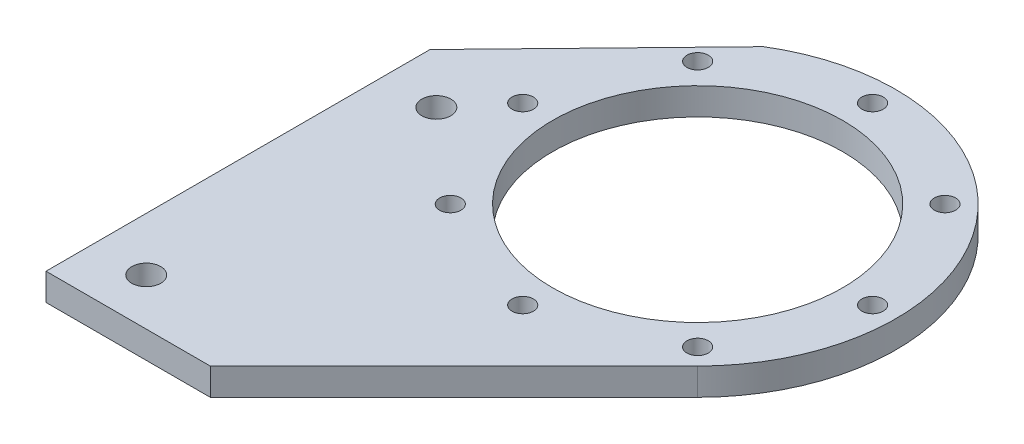
ISO-10303-21;
HEADER;
FILE_DESCRIPTION(('STEP AP214'),'2;1');
FILE_NAME('part.step','',(''),(''),'','','');
FILE_SCHEMA(('AUTOMOTIVE_DESIGN { 1 0 10303 214 1 1 1 1 }'));
ENDSEC;
DATA;
#1=APPLICATION_CONTEXT('core data for automotive mechanical design processes');
#2=APPLICATION_PROTOCOL_DEFINITION('international standard','automotive_design',2000,#1);
#3=PRODUCT_CONTEXT('',#1,'mechanical');
#4=PRODUCT('Part','Part','',(#3));
#5=PRODUCT_RELATED_PRODUCT_CATEGORY('part','',(#4));
#6=PRODUCT_DEFINITION_FORMATION('','',#4);
#7=PRODUCT_DEFINITION_CONTEXT('part definition',#1,'design');
#8=PRODUCT_DEFINITION('design','',#6,#7);
#9=PRODUCT_DEFINITION_SHAPE('','',#8);
#10=(LENGTH_UNIT() NAMED_UNIT(*) SI_UNIT(.MILLI.,.METRE.));
#11=(NAMED_UNIT(*) PLANE_ANGLE_UNIT() SI_UNIT($,.RADIAN.));
#12=(NAMED_UNIT(*) SI_UNIT($,.STERADIAN.) SOLID_ANGLE_UNIT());
#13=UNCERTAINTY_MEASURE_WITH_UNIT(LENGTH_MEASURE(1.E-05),#10,'distance_accuracy_value','');
#14=(GEOMETRIC_REPRESENTATION_CONTEXT(3) GLOBAL_UNCERTAINTY_ASSIGNED_CONTEXT((#13)) GLOBAL_UNIT_ASSIGNED_CONTEXT((#10,
#11,#12)) REPRESENTATION_CONTEXT('',''));
#15=CARTESIAN_POINT('',(0.,0.,0.));
#16=DIRECTION('',(0.,0.,1.));
#17=DIRECTION('',(1.,0.,0.));
#18=AXIS2_PLACEMENT_3D('',#15,#16,#17);
#19=CARTESIAN_POINT('',(0.,-6.35,0.));
#20=DIRECTION('',(-1.,0.,0.));
#21=DIRECTION('',(0.,0.,1.));
#22=AXIS2_PLACEMENT_3D('',#19,#20,#21);
#23=PLANE('',#22);
#24=DIRECTION('',(0.,0.,1.));
#25=VECTOR('',#24,1.);
#26=CARTESIAN_POINT('',(0.,0.,0.));
#27=LINE('',#26,#25);
#28=CARTESIAN_POINT('',(0.,0.,-90.));
#29=VERTEX_POINT('',#28);
#30=CARTESIAN_POINT('',(0.,0.,0.));
#31=VERTEX_POINT('',#30);
#32=EDGE_CURVE('E118',#29,#31,#27,.T.);
#33=ORIENTED_EDGE('',*,*,#32,.F.);
#34=DIRECTION('',(0.,1.,0.));
#35=VECTOR('',#34,1.);
#36=CARTESIAN_POINT('',(0.,-6.35,-90.));
#37=LINE('',#36,#35);
#38=CARTESIAN_POINT('',(0.,-6.35,-90.));
#39=VERTEX_POINT('',#38);
#40=EDGE_CURVE('E11',#39,#29,#37,.T.);
#41=ORIENTED_EDGE('',*,*,#40,.F.);
#42=DIRECTION('',(0.,0.,1.));
#43=VECTOR('',#42,1.);
#44=CARTESIAN_POINT('',(0.,-6.35,0.));
#45=LINE('',#44,#43);
#46=CARTESIAN_POINT('',(0.,-6.35,0.));
#47=VERTEX_POINT('',#46);
#48=EDGE_CURVE('E113',#39,#47,#45,.T.);
#49=ORIENTED_EDGE('',*,*,#48,.T.);
#50=DIRECTION('',(0.,1.,0.));
#51=VECTOR('',#50,1.);
#52=CARTESIAN_POINT('',(0.,-6.35,0.));
#53=LINE('',#52,#51);
#54=EDGE_CURVE('E44',#47,#31,#53,.T.);
#55=ORIENTED_EDGE('',*,*,#54,.T.);
#56=EDGE_LOOP('',(#33,#41,#49,#55));
#57=FACE_BOUND('',#56,.T.);
#58=ADVANCED_FACE('F41',(#57),#23,.T.);
#59=CARTESIAN_POINT('',(0.,-6.35,-90.));
#60=DIRECTION('',(-0.717622638837594,0.,-0.69643215622756));
#61=DIRECTION('',(-0.69643215622756,0.,0.717622638837594));
#62=AXIS2_PLACEMENT_3D('',#59,#60,#61);
#63=PLANE('',#62);
#64=DIRECTION('',(-0.69643215622756,0.,0.717622638837594));
#65=VECTOR('',#64,1.);
#66=CARTESIAN_POINT('',(0.,0.,-90.));
#67=LINE('',#66,#65);
#68=CARTESIAN_POINT('',(38.5109306503488,0.,-129.682710555893));
#69=VERTEX_POINT('',#68);
#70=EDGE_CURVE('E128',#69,#29,#67,.T.);
#71=ORIENTED_EDGE('',*,*,#70,.F.);
#72=DIRECTION('',(0.,1.,0.));
#73=VECTOR('',#72,1.);
#74=CARTESIAN_POINT('',(38.5109306503488,-6.35,-129.682710555893));
#75=LINE('',#74,#73);
#76=CARTESIAN_POINT('',(38.5109306503488,-6.35,-129.682710555893));
#77=VERTEX_POINT('',#76);
#78=EDGE_CURVE('E50',#77,#69,#75,.T.);
#79=ORIENTED_EDGE('',*,*,#78,.F.);
#80=DIRECTION('',(-0.69643215622756,0.,0.717622638837594));
#81=VECTOR('',#80,1.);
#82=CARTESIAN_POINT('',(0.,-6.35,-90.));
#83=LINE('',#82,#81);
#84=EDGE_CURVE('E108',#77,#39,#83,.T.);
#85=ORIENTED_EDGE('',*,*,#84,.T.);
#86=ORIENTED_EDGE('',*,*,#40,.T.);
#87=EDGE_LOOP('',(#71,#79,#85,#86));
#88=FACE_BOUND('',#87,.T.);
#89=ADVANCED_FACE('F134',(#88),#63,.T.);
#90=CARTESIAN_POINT('',(62.75,-6.35,-90.));
#91=DIRECTION('',(0.,1.,0.));
#92=DIRECTION('',(0.,0.,1.));
#93=AXIS2_PLACEMENT_3D('',#90,#91,#92);
#94=CYLINDRICAL_SURFACE('',#93,46.5);
#95=CARTESIAN_POINT('',(62.75,0.,-90.));
#96=DIRECTION('',(0.,1.,0.));
#97=DIRECTION('',(0.,0.,-1.));
#98=AXIS2_PLACEMENT_3D('',#95,#96,#97);
#99=CIRCLE('',#98,46.5);
#100=CARTESIAN_POINT('',(95.6304653251744,0.,-57.1195346748255));
#101=VERTEX_POINT('',#100);
#102=EDGE_CURVE('E97',#101,#69,#99,.T.);
#103=ORIENTED_EDGE('',*,*,#102,.F.);
#104=DIRECTION('',(0.,1.,0.));
#105=VECTOR('',#104,1.);
#106=CARTESIAN_POINT('',(95.6304653251744,-6.35,-57.1195346748255));
#107=LINE('',#106,#105);
#108=CARTESIAN_POINT('',(95.6304653251744,-6.35,-57.1195346748255));
#109=VERTEX_POINT('',#108);
#110=EDGE_CURVE('E92',#109,#101,#107,.T.);
#111=ORIENTED_EDGE('',*,*,#110,.F.);
#112=CARTESIAN_POINT('',(62.75,-6.35,-90.));
#113=DIRECTION('',(0.,1.,0.));
#114=DIRECTION('',(0.,0.,-1.));
#115=AXIS2_PLACEMENT_3D('',#112,#113,#114);
#116=CIRCLE('',#115,46.5);
#117=EDGE_CURVE('E95',#109,#77,#116,.T.);
#118=ORIENTED_EDGE('',*,*,#117,.T.);
#119=ORIENTED_EDGE('',*,*,#78,.T.);
#120=EDGE_LOOP('',(#103,#111,#118,#119));
#121=FACE_BOUND('',#120,.T.);
#122=ADVANCED_FACE('F94',(#121),#94,.T.);
#123=CARTESIAN_POINT('',(95.6304653251744,-6.35,-57.1195346748255));
#124=DIRECTION('',(0.707106781186547,0.,0.707106781186548));
#125=DIRECTION('',(0.707106781186548,0.,-0.707106781186547));
#126=AXIS2_PLACEMENT_3D('',#123,#124,#125);
#127=PLANE('',#126);
#128=DIRECTION('',(0.707106781186549,0.,-0.707106781186547));
#129=VECTOR('',#128,1.);
#130=CARTESIAN_POINT('',(95.6304653251744,0.,-57.1195346748255));
#131=LINE('',#130,#129);
#132=CARTESIAN_POINT('',(38.5109306503488,0.,0.));
#133=VERTEX_POINT('',#132);
#134=EDGE_CURVE('E125',#133,#101,#131,.T.);
#135=ORIENTED_EDGE('',*,*,#134,.F.);
#136=DIRECTION('',(0.,1.,0.));
#137=VECTOR('',#136,1.);
#138=CARTESIAN_POINT('',(38.5109306503488,-6.35,0.));
#139=LINE('',#138,#137);
#140=CARTESIAN_POINT('',(38.5109306503488,-6.35,0.));
#141=VERTEX_POINT('',#140);
#142=EDGE_CURVE('E102',#141,#133,#139,.T.);
#143=ORIENTED_EDGE('',*,*,#142,.F.);
#144=DIRECTION('',(0.707106781186549,0.,-0.707106781186547));
#145=VECTOR('',#144,1.);
#146=CARTESIAN_POINT('',(95.6304653251744,-6.35,-57.1195346748255));
#147=LINE('',#146,#145);
#148=EDGE_CURVE('E107',#141,#109,#147,.T.);
#149=ORIENTED_EDGE('',*,*,#148,.T.);
#150=ORIENTED_EDGE('',*,*,#110,.T.);
#151=EDGE_LOOP('',(#135,#143,#149,#150));
#152=FACE_BOUND('',#151,.T.);
#153=ADVANCED_FACE('F110',(#152),#127,.T.);
#154=CARTESIAN_POINT('',(0.,-6.35,0.));
#155=DIRECTION('',(0.,0.,1.));
#156=DIRECTION('',(1.,0.,0.));
#157=AXIS2_PLACEMENT_3D('',#154,#155,#156);
#158=PLANE('',#157);
#159=DIRECTION('',(1.,0.,0.));
#160=VECTOR('',#159,1.);
#161=CARTESIAN_POINT('',(0.,0.,0.));
#162=LINE('',#161,#160);
#163=EDGE_CURVE('E121',#31,#133,#162,.T.);
#164=ORIENTED_EDGE('',*,*,#163,.F.);
#165=ORIENTED_EDGE('',*,*,#54,.F.);
#166=DIRECTION('',(1.,0.,0.));
#167=VECTOR('',#166,1.);
#168=CARTESIAN_POINT('',(0.,-6.35,0.));
#169=LINE('',#168,#167);
#170=EDGE_CURVE('E111',#47,#141,#169,.T.);
#171=ORIENTED_EDGE('',*,*,#170,.T.);
#172=ORIENTED_EDGE('',*,*,#142,.T.);
#173=EDGE_LOOP('',(#164,#165,#171,#172));
#174=FACE_BOUND('',#173,.T.);
#175=ADVANCED_FACE('F131',(#174),#158,.T.);
#176=CARTESIAN_POINT('',(62.75,-6.35,-90.));
#177=DIRECTION('',(0.,-1.,0.));
#178=DIRECTION('',(0.,0.,-1.));
#179=AXIS2_PLACEMENT_3D('',#176,#177,#178);
#180=PLANE('',#179);
#181=CARTESIAN_POINT('',(62.75,-6.35,-131.));
#182=DIRECTION('',(0.,1.,0.));
#183=DIRECTION('',(0.,0.,1.));
#184=AXIS2_PLACEMENT_3D('',#181,#182,#183);
#185=CIRCLE('',#184,2.50000000000002);
#186=CARTESIAN_POINT('',(62.75,-6.35,-128.5));
#187=VERTEX_POINT('',#186);
#188=EDGE_CURVE('E205',#187,#187,#185,.T.);
#189=ORIENTED_EDGE('',*,*,#188,.T.);
#190=EDGE_LOOP('',(#189));
#191=FACE_BOUND('',#190,.T.);
#192=CARTESIAN_POINT('',(91.741378028649,-6.35,-118.99137802865));
#193=DIRECTION('',(0.,1.,0.));
#194=DIRECTION('',(0.,0.,1.));
#195=AXIS2_PLACEMENT_3D('',#192,#193,#194);
#196=CIRCLE('',#195,2.5);
#197=CARTESIAN_POINT('',(91.741378028649,-6.35,-116.49137802865));
#198=VERTEX_POINT('',#197);
#199=EDGE_CURVE('E214',#198,#198,#196,.T.);
#200=ORIENTED_EDGE('',*,*,#199,.T.);
#201=EDGE_LOOP('',(#200));
#202=FACE_BOUND('',#201,.T.);
#203=CARTESIAN_POINT('',(103.750000000001,-6.35,-90.));
#204=DIRECTION('',(0.,1.,0.));
#205=DIRECTION('',(0.,0.,1.));
#206=AXIS2_PLACEMENT_3D('',#203,#204,#205);
#207=CIRCLE('',#206,2.49999999999864);
#208=CARTESIAN_POINT('',(103.750000000001,-6.35,-87.5000000000014));
#209=VERTEX_POINT('',#208);
#210=EDGE_CURVE('E222',#209,#209,#207,.T.);
#211=ORIENTED_EDGE('',*,*,#210,.T.);
#212=EDGE_LOOP('',(#211));
#213=FACE_BOUND('',#212,.T.);
#214=CARTESIAN_POINT('',(91.7413780286484,-6.35,-61.0086219713516));
#215=DIRECTION('',(0.,1.,0.));
#216=DIRECTION('',(0.,0.,1.));
#217=AXIS2_PLACEMENT_3D('',#214,#215,#216);
#218=CIRCLE('',#217,2.49999999999776);
#219=CARTESIAN_POINT('',(91.7413780286484,-6.35,-58.5086219713538));
#220=VERTEX_POINT('',#219);
#221=EDGE_CURVE('E228',#220,#220,#218,.T.);
#222=ORIENTED_EDGE('',*,*,#221,.T.);
#223=EDGE_LOOP('',(#222));
#224=FACE_BOUND('',#223,.T.);
#225=CARTESIAN_POINT('',(62.75,-6.35,-49.));
#226=DIRECTION('',(0.,1.,0.));
#227=DIRECTION('',(0.,0.,1.));
#228=AXIS2_PLACEMENT_3D('',#225,#226,#227);
#229=CIRCLE('',#228,2.49999999999695);
#230=CARTESIAN_POINT('',(62.75,-6.35,-46.5000000000031));
#231=VERTEX_POINT('',#230);
#232=EDGE_CURVE('E234',#231,#231,#229,.T.);
#233=ORIENTED_EDGE('',*,*,#232,.T.);
#234=EDGE_LOOP('',(#233));
#235=FACE_BOUND('',#234,.T.);
#236=CARTESIAN_POINT('',(33.7586219713516,-6.35,-61.0086219713516));
#237=DIRECTION('',(0.,1.,0.));
#238=DIRECTION('',(0.,0.,1.));
#239=AXIS2_PLACEMENT_3D('',#236,#237,#238);
#240=CIRCLE('',#239,2.49999999999721);
#241=CARTESIAN_POINT('',(33.7586219713516,-6.35,-58.5086219713543));
#242=VERTEX_POINT('',#241);
#243=EDGE_CURVE('E240',#242,#242,#240,.T.);
#244=ORIENTED_EDGE('',*,*,#243,.T.);
#245=EDGE_LOOP('',(#244));
#246=FACE_BOUND('',#245,.T.);
#247=CARTESIAN_POINT('',(21.75,-6.35,-90.));
#248=DIRECTION('',(0.,1.,0.));
#249=DIRECTION('',(0.,0.,1.));
#250=AXIS2_PLACEMENT_3D('',#247,#248,#249);
#251=CIRCLE('',#250,2.49999999999823);
#252=CARTESIAN_POINT('',(21.75,-6.35,-87.5000000000018));
#253=VERTEX_POINT('',#252);
#254=EDGE_CURVE('E246',#253,#253,#251,.T.);
#255=ORIENTED_EDGE('',*,*,#254,.T.);
#256=EDGE_LOOP('',(#255));
#257=FACE_BOUND('',#256,.T.);
#258=CARTESIAN_POINT('',(33.7586219713524,-6.35,-118.991378028648));
#259=DIRECTION('',(0.,1.,0.));
#260=DIRECTION('',(0.,0.,1.));
#261=AXIS2_PLACEMENT_3D('',#258,#259,#260);
#262=CIRCLE('',#261,2.49999999999999);
#263=CARTESIAN_POINT('',(33.7586219713524,-6.35,-116.491378028648));
#264=VERTEX_POINT('',#263);
#265=EDGE_CURVE('E252',#264,#264,#262,.T.);
#266=ORIENTED_EDGE('',*,*,#265,.T.);
#267=EDGE_LOOP('',(#266));
#268=FACE_BOUND('',#267,.T.);
#269=CARTESIAN_POINT('',(62.75,-6.35,-90.));
#270=DIRECTION('',(0.,1.,0.));
#271=DIRECTION('',(0.,0.,1.));
#272=AXIS2_PLACEMENT_3D('',#269,#270,#271);
#273=CIRCLE('',#272,34.);
#274=CARTESIAN_POINT('',(62.75,-6.35,-56.));
#275=VERTEX_POINT('',#274);
#276=EDGE_CURVE('E255',#275,#275,#273,.T.);
#277=ORIENTED_EDGE('',*,*,#276,.T.);
#278=EDGE_LOOP('',(#277));
#279=FACE_BOUND('',#278,.T.);
#280=CARTESIAN_POINT('',(12.5,-6.35,-79.));
#281=DIRECTION('',(0.,1.,0.));
#282=DIRECTION('',(0.,0.,1.));
#283=AXIS2_PLACEMENT_3D('',#280,#281,#282);
#284=CIRCLE('',#283,3.4);
#285=CARTESIAN_POINT('',(12.5,-6.35,-75.6));
#286=VERTEX_POINT('',#285);
#287=EDGE_CURVE('E122',#286,#286,#284,.T.);
#288=ORIENTED_EDGE('',*,*,#287,.T.);
#289=EDGE_LOOP('',(#288));
#290=FACE_BOUND('',#289,.T.);
#291=CARTESIAN_POINT('',(12.5,-6.35,-11.));
#292=DIRECTION('',(0.,1.,0.));
#293=DIRECTION('',(0.,0.,-1.));
#294=AXIS2_PLACEMENT_3D('',#291,#292,#293);
#295=CIRCLE('',#294,3.4);
#296=CARTESIAN_POINT('',(12.5,-6.35,-14.4));
#297=VERTEX_POINT('',#296);
#298=EDGE_CURVE('E258',#297,#297,#295,.T.);
#299=ORIENTED_EDGE('',*,*,#298,.T.);
#300=EDGE_LOOP('',(#299));
#301=FACE_BOUND('',#300,.T.);
#302=ORIENTED_EDGE('',*,*,#48,.F.);
#303=ORIENTED_EDGE('',*,*,#84,.F.);
#304=ORIENTED_EDGE('',*,*,#117,.F.);
#305=ORIENTED_EDGE('',*,*,#148,.F.);
#306=ORIENTED_EDGE('',*,*,#170,.F.);
#307=EDGE_LOOP('',(#302,#303,#304,#305,#306));
#308=FACE_BOUND('',#307,.T.);
#309=ADVANCED_FACE('F106',(#191,#202,#213,#224,#235,#246,#257,#268,#279,#290,#301,#308),#180,.T.);
#310=CARTESIAN_POINT('',(62.75,0.,-90.));
#311=DIRECTION('',(0.,-1.,0.));
#312=DIRECTION('',(0.,0.,-1.));
#313=AXIS2_PLACEMENT_3D('',#310,#311,#312);
#314=PLANE('',#313);
#315=CARTESIAN_POINT('',(62.75,0.,-131.));
#316=DIRECTION('',(0.,1.,0.));
#317=DIRECTION('',(0.,0.,1.));
#318=AXIS2_PLACEMENT_3D('',#315,#316,#317);
#319=CIRCLE('',#318,2.50000000000002);
#320=CARTESIAN_POINT('',(62.75,0.,-128.5));
#321=VERTEX_POINT('',#320);
#322=EDGE_CURVE('E208',#321,#321,#319,.T.);
#323=ORIENTED_EDGE('',*,*,#322,.F.);
#324=EDGE_LOOP('',(#323));
#325=FACE_BOUND('',#324,.T.);
#326=CARTESIAN_POINT('',(91.741378028649,0.,-118.99137802865));
#327=DIRECTION('',(0.,1.,0.));
#328=DIRECTION('',(0.,0.,1.));
#329=AXIS2_PLACEMENT_3D('',#326,#327,#328);
#330=CIRCLE('',#329,2.5);
#331=CARTESIAN_POINT('',(91.741378028649,0.,-116.49137802865));
#332=VERTEX_POINT('',#331);
#333=EDGE_CURVE('E209',#332,#332,#330,.T.);
#334=ORIENTED_EDGE('',*,*,#333,.F.);
#335=EDGE_LOOP('',(#334));
#336=FACE_BOUND('',#335,.T.);
#337=CARTESIAN_POINT('',(103.750000000001,0.,-90.));
#338=DIRECTION('',(0.,1.,0.));
#339=DIRECTION('',(0.,0.,1.));
#340=AXIS2_PLACEMENT_3D('',#337,#338,#339);
#341=CIRCLE('',#340,2.49999999999864);
#342=CARTESIAN_POINT('',(103.750000000001,0.,-87.5000000000014));
#343=VERTEX_POINT('',#342);
#344=EDGE_CURVE('E219',#343,#343,#341,.T.);
#345=ORIENTED_EDGE('',*,*,#344,.F.);
#346=EDGE_LOOP('',(#345));
#347=FACE_BOUND('',#346,.T.);
#348=CARTESIAN_POINT('',(91.7413780286484,0.,-61.0086219713516));
#349=DIRECTION('',(0.,1.,0.));
#350=DIRECTION('',(0.,0.,1.));
#351=AXIS2_PLACEMENT_3D('',#348,#349,#350);
#352=CIRCLE('',#351,2.49999999999776);
#353=CARTESIAN_POINT('',(91.7413780286484,0.,-58.5086219713538));
#354=VERTEX_POINT('',#353);
#355=EDGE_CURVE('E225',#354,#354,#352,.T.);
#356=ORIENTED_EDGE('',*,*,#355,.F.);
#357=EDGE_LOOP('',(#356));
#358=FACE_BOUND('',#357,.T.);
#359=CARTESIAN_POINT('',(62.75,0.,-49.));
#360=DIRECTION('',(0.,1.,0.));
#361=DIRECTION('',(0.,0.,1.));
#362=AXIS2_PLACEMENT_3D('',#359,#360,#361);
#363=CIRCLE('',#362,2.49999999999695);
#364=CARTESIAN_POINT('',(62.75,0.,-46.5000000000031));
#365=VERTEX_POINT('',#364);
#366=EDGE_CURVE('E231',#365,#365,#363,.T.);
#367=ORIENTED_EDGE('',*,*,#366,.F.);
#368=EDGE_LOOP('',(#367));
#369=FACE_BOUND('',#368,.T.);
#370=CARTESIAN_POINT('',(33.7586219713516,0.,-61.0086219713516));
#371=DIRECTION('',(0.,1.,0.));
#372=DIRECTION('',(0.,0.,1.));
#373=AXIS2_PLACEMENT_3D('',#370,#371,#372);
#374=CIRCLE('',#373,2.49999999999721);
#375=CARTESIAN_POINT('',(33.7586219713516,0.,-58.5086219713543));
#376=VERTEX_POINT('',#375);
#377=EDGE_CURVE('E237',#376,#376,#374,.T.);
#378=ORIENTED_EDGE('',*,*,#377,.F.);
#379=EDGE_LOOP('',(#378));
#380=FACE_BOUND('',#379,.T.);
#381=CARTESIAN_POINT('',(21.75,0.,-90.));
#382=DIRECTION('',(0.,1.,0.));
#383=DIRECTION('',(0.,0.,1.));
#384=AXIS2_PLACEMENT_3D('',#381,#382,#383);
#385=CIRCLE('',#384,2.49999999999823);
#386=CARTESIAN_POINT('',(21.75,0.,-87.5000000000018));
#387=VERTEX_POINT('',#386);
#388=EDGE_CURVE('E243',#387,#387,#385,.T.);
#389=ORIENTED_EDGE('',*,*,#388,.F.);
#390=EDGE_LOOP('',(#389));
#391=FACE_BOUND('',#390,.T.);
#392=CARTESIAN_POINT('',(33.7586219713524,0.,-118.991378028648));
#393=DIRECTION('',(0.,1.,0.));
#394=DIRECTION('',(0.,0.,1.));
#395=AXIS2_PLACEMENT_3D('',#392,#393,#394);
#396=CIRCLE('',#395,2.49999999999999);
#397=CARTESIAN_POINT('',(33.7586219713524,0.,-116.491378028648));
#398=VERTEX_POINT('',#397);
#399=EDGE_CURVE('E249',#398,#398,#396,.T.);
#400=ORIENTED_EDGE('',*,*,#399,.F.);
#401=EDGE_LOOP('',(#400));
#402=FACE_BOUND('',#401,.T.);
#403=CARTESIAN_POINT('',(62.75,0.,-90.));
#404=DIRECTION('',(0.,1.,0.));
#405=DIRECTION('',(0.,0.,1.));
#406=AXIS2_PLACEMENT_3D('',#403,#404,#405);
#407=CIRCLE('',#406,34.);
#408=CARTESIAN_POINT('',(62.75,0.,-56.));
#409=VERTEX_POINT('',#408);
#410=EDGE_CURVE('E211',#409,#409,#407,.T.);
#411=ORIENTED_EDGE('',*,*,#410,.F.);
#412=EDGE_LOOP('',(#411));
#413=FACE_BOUND('',#412,.T.);
#414=CARTESIAN_POINT('',(12.5,0.,-79.));
#415=DIRECTION('',(0.,1.,0.));
#416=DIRECTION('',(0.,0.,1.));
#417=AXIS2_PLACEMENT_3D('',#414,#415,#416);
#418=CIRCLE('',#417,3.4);
#419=CARTESIAN_POINT('',(12.5,0.,-75.6));
#420=VERTEX_POINT('',#419);
#421=EDGE_CURVE('E263',#420,#420,#418,.T.);
#422=ORIENTED_EDGE('',*,*,#421,.F.);
#423=EDGE_LOOP('',(#422));
#424=FACE_BOUND('',#423,.T.);
#425=CARTESIAN_POINT('',(12.5,0.,-11.));
#426=DIRECTION('',(0.,1.,0.));
#427=DIRECTION('',(0.,0.,-1.));
#428=AXIS2_PLACEMENT_3D('',#425,#426,#427);
#429=CIRCLE('',#428,3.4);
#430=CARTESIAN_POINT('',(12.5,0.,-14.4));
#431=VERTEX_POINT('',#430);
#432=EDGE_CURVE('E266',#431,#431,#429,.T.);
#433=ORIENTED_EDGE('',*,*,#432,.F.);
#434=EDGE_LOOP('',(#433));
#435=FACE_BOUND('',#434,.T.);
#436=ORIENTED_EDGE('',*,*,#32,.T.);
#437=ORIENTED_EDGE('',*,*,#163,.T.);
#438=ORIENTED_EDGE('',*,*,#134,.T.);
#439=ORIENTED_EDGE('',*,*,#102,.T.);
#440=ORIENTED_EDGE('',*,*,#70,.T.);
#441=EDGE_LOOP('',(#436,#437,#438,#439,#440));
#442=FACE_BOUND('',#441,.T.);
#443=ADVANCED_FACE('F133',(#325,#336,#347,#358,#369,#380,#391,#402,#413,#424,#435,#442),#314,.F.);
#444=CARTESIAN_POINT('',(12.5,-6.35,-11.));
#445=DIRECTION('',(0.,1.,0.));
#446=DIRECTION('',(0.,0.,1.));
#447=AXIS2_PLACEMENT_3D('',#444,#445,#446);
#448=CYLINDRICAL_SURFACE('',#447,3.4);
#449=ORIENTED_EDGE('',*,*,#298,.F.);
#450=EDGE_LOOP('',(#449));
#451=FACE_BOUND('',#450,.T.);
#452=ORIENTED_EDGE('',*,*,#432,.T.);
#453=EDGE_LOOP('',(#452));
#454=FACE_BOUND('',#453,.T.);
#455=ADVANCED_FACE('F154',(#451,#454),#448,.F.);
#456=CARTESIAN_POINT('',(12.5,-6.35,-79.));
#457=DIRECTION('',(0.,1.,0.));
#458=DIRECTION('',(0.,0.,1.));
#459=AXIS2_PLACEMENT_3D('',#456,#457,#458);
#460=CYLINDRICAL_SURFACE('',#459,3.4);
#461=ORIENTED_EDGE('',*,*,#287,.F.);
#462=EDGE_LOOP('',(#461));
#463=FACE_BOUND('',#462,.T.);
#464=ORIENTED_EDGE('',*,*,#421,.T.);
#465=EDGE_LOOP('',(#464));
#466=FACE_BOUND('',#465,.T.);
#467=ADVANCED_FACE('F161',(#463,#466),#460,.F.);
#468=CARTESIAN_POINT('',(62.75,-6.35,-90.));
#469=DIRECTION('',(0.,1.,0.));
#470=DIRECTION('',(0.,0.,1.));
#471=AXIS2_PLACEMENT_3D('',#468,#469,#470);
#472=CYLINDRICAL_SURFACE('',#471,34.);
#473=ORIENTED_EDGE('',*,*,#276,.F.);
#474=EDGE_LOOP('',(#473));
#475=FACE_BOUND('',#474,.T.);
#476=ORIENTED_EDGE('',*,*,#410,.T.);
#477=EDGE_LOOP('',(#476));
#478=FACE_BOUND('',#477,.T.);
#479=ADVANCED_FACE('F165',(#475,#478),#472,.F.);
#480=CARTESIAN_POINT('',(33.7586219713524,-6.35,-118.991378028648));
#481=DIRECTION('',(0.,1.,0.));
#482=DIRECTION('',(0.,0.,1.));
#483=AXIS2_PLACEMENT_3D('',#480,#481,#482);
#484=CYLINDRICAL_SURFACE('',#483,2.49999999999999);
#485=ORIENTED_EDGE('',*,*,#265,.F.);
#486=EDGE_LOOP('',(#485));
#487=FACE_BOUND('',#486,.T.);
#488=ORIENTED_EDGE('',*,*,#399,.T.);
#489=EDGE_LOOP('',(#488));
#490=FACE_BOUND('',#489,.T.);
#491=ADVANCED_FACE('F169',(#487,#490),#484,.F.);
#492=CARTESIAN_POINT('',(21.75,-6.35,-90.));
#493=DIRECTION('',(0.,1.,0.));
#494=DIRECTION('',(0.,0.,1.));
#495=AXIS2_PLACEMENT_3D('',#492,#493,#494);
#496=CYLINDRICAL_SURFACE('',#495,2.49999999999823);
#497=ORIENTED_EDGE('',*,*,#254,.F.);
#498=EDGE_LOOP('',(#497));
#499=FACE_BOUND('',#498,.T.);
#500=ORIENTED_EDGE('',*,*,#388,.T.);
#501=EDGE_LOOP('',(#500));
#502=FACE_BOUND('',#501,.T.);
#503=ADVANCED_FACE('F173',(#499,#502),#496,.F.);
#504=CARTESIAN_POINT('',(33.7586219713516,-6.35,-61.0086219713516));
#505=DIRECTION('',(0.,1.,0.));
#506=DIRECTION('',(0.,0.,1.));
#507=AXIS2_PLACEMENT_3D('',#504,#505,#506);
#508=CYLINDRICAL_SURFACE('',#507,2.49999999999721);
#509=ORIENTED_EDGE('',*,*,#243,.F.);
#510=EDGE_LOOP('',(#509));
#511=FACE_BOUND('',#510,.T.);
#512=ORIENTED_EDGE('',*,*,#377,.T.);
#513=EDGE_LOOP('',(#512));
#514=FACE_BOUND('',#513,.T.);
#515=ADVANCED_FACE('F177',(#511,#514),#508,.F.);
#516=CARTESIAN_POINT('',(62.75,-6.35,-49.));
#517=DIRECTION('',(0.,1.,0.));
#518=DIRECTION('',(0.,0.,1.));
#519=AXIS2_PLACEMENT_3D('',#516,#517,#518);
#520=CYLINDRICAL_SURFACE('',#519,2.49999999999695);
#521=ORIENTED_EDGE('',*,*,#232,.F.);
#522=EDGE_LOOP('',(#521));
#523=FACE_BOUND('',#522,.T.);
#524=ORIENTED_EDGE('',*,*,#366,.T.);
#525=EDGE_LOOP('',(#524));
#526=FACE_BOUND('',#525,.T.);
#527=ADVANCED_FACE('F181',(#523,#526),#520,.F.);
#528=CARTESIAN_POINT('',(91.7413780286484,-6.35,-61.0086219713516));
#529=DIRECTION('',(0.,1.,0.));
#530=DIRECTION('',(0.,0.,1.));
#531=AXIS2_PLACEMENT_3D('',#528,#529,#530);
#532=CYLINDRICAL_SURFACE('',#531,2.49999999999776);
#533=ORIENTED_EDGE('',*,*,#221,.F.);
#534=EDGE_LOOP('',(#533));
#535=FACE_BOUND('',#534,.T.);
#536=ORIENTED_EDGE('',*,*,#355,.T.);
#537=EDGE_LOOP('',(#536));
#538=FACE_BOUND('',#537,.T.);
#539=ADVANCED_FACE('F185',(#535,#538),#532,.F.);
#540=CARTESIAN_POINT('',(103.750000000001,-6.35,-90.));
#541=DIRECTION('',(0.,1.,0.));
#542=DIRECTION('',(0.,0.,1.));
#543=AXIS2_PLACEMENT_3D('',#540,#541,#542);
#544=CYLINDRICAL_SURFACE('',#543,2.49999999999864);
#545=ORIENTED_EDGE('',*,*,#210,.F.);
#546=EDGE_LOOP('',(#545));
#547=FACE_BOUND('',#546,.T.);
#548=ORIENTED_EDGE('',*,*,#344,.T.);
#549=EDGE_LOOP('',(#548));
#550=FACE_BOUND('',#549,.T.);
#551=ADVANCED_FACE('F189',(#547,#550),#544,.F.);
#552=CARTESIAN_POINT('',(91.741378028649,-6.35,-118.99137802865));
#553=DIRECTION('',(0.,1.,0.));
#554=DIRECTION('',(0.,0.,1.));
#555=AXIS2_PLACEMENT_3D('',#552,#553,#554);
#556=CYLINDRICAL_SURFACE('',#555,2.5);
#557=ORIENTED_EDGE('',*,*,#199,.F.);
#558=EDGE_LOOP('',(#557));
#559=FACE_BOUND('',#558,.T.);
#560=ORIENTED_EDGE('',*,*,#333,.T.);
#561=EDGE_LOOP('',(#560));
#562=FACE_BOUND('',#561,.T.);
#563=ADVANCED_FACE('F193',(#559,#562),#556,.F.);
#564=CARTESIAN_POINT('',(62.75,-6.35,-131.));
#565=DIRECTION('',(0.,1.,0.));
#566=DIRECTION('',(0.,0.,1.));
#567=AXIS2_PLACEMENT_3D('',#564,#565,#566);
#568=CYLINDRICAL_SURFACE('',#567,2.50000000000002);
#569=ORIENTED_EDGE('',*,*,#188,.F.);
#570=EDGE_LOOP('',(#569));
#571=FACE_BOUND('',#570,.T.);
#572=ORIENTED_EDGE('',*,*,#322,.T.);
#573=EDGE_LOOP('',(#572));
#574=FACE_BOUND('',#573,.T.);
#575=ADVANCED_FACE('F197',(#571,#574),#568,.F.);
#576=CLOSED_SHELL('',(#58,#89,#122,#153,#175,#309,#443,#455,#467,#479,#491,#503,#515,#527,#539,
#551,#563,#575));
#577=MANIFOLD_SOLID_BREP('B2',#576);
#578=ADVANCED_BREP_SHAPE_REPRESENTATION('',(#18,#577),#14);
#579=SHAPE_DEFINITION_REPRESENTATION(#9,#578);
ENDSEC;
END-ISO-10303-21;
